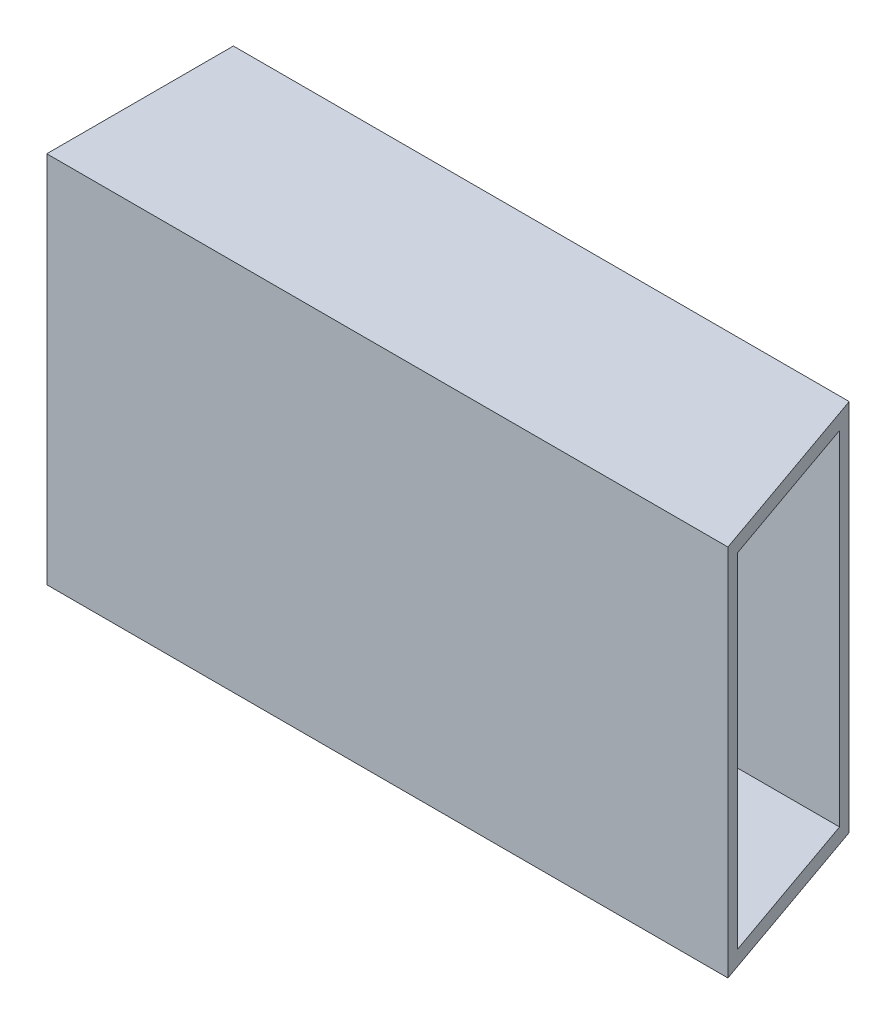
ISO-10303-21;
HEADER;
FILE_DESCRIPTION(('STEP AP214'),'2;1');
FILE_NAME('part.step','',(''),(''),'','','');
FILE_SCHEMA(('AUTOMOTIVE_DESIGN { 1 0 10303 214 1 1 1 1 }'));
ENDSEC;
DATA;
#1=APPLICATION_CONTEXT('core data for automotive mechanical design processes');
#2=APPLICATION_PROTOCOL_DEFINITION('international standard','automotive_design',2000,#1);
#3=PRODUCT_CONTEXT('',#1,'mechanical');
#4=PRODUCT('Part','Part','',(#3));
#5=PRODUCT_RELATED_PRODUCT_CATEGORY('part','',(#4));
#6=PRODUCT_DEFINITION_FORMATION('','',#4);
#7=PRODUCT_DEFINITION_CONTEXT('part definition',#1,'design');
#8=PRODUCT_DEFINITION('design','',#6,#7);
#9=PRODUCT_DEFINITION_SHAPE('','',#8);
#10=(LENGTH_UNIT() NAMED_UNIT(*) SI_UNIT(.MILLI.,.METRE.));
#11=(NAMED_UNIT(*) PLANE_ANGLE_UNIT() SI_UNIT($,.RADIAN.));
#12=(NAMED_UNIT(*) SI_UNIT($,.STERADIAN.) SOLID_ANGLE_UNIT());
#13=UNCERTAINTY_MEASURE_WITH_UNIT(LENGTH_MEASURE(1.E-05),#10,'distance_accuracy_value','');
#14=(GEOMETRIC_REPRESENTATION_CONTEXT(3) GLOBAL_UNCERTAINTY_ASSIGNED_CONTEXT((#13)) GLOBAL_UNIT_ASSIGNED_CONTEXT((#10,
#11,#12)) REPRESENTATION_CONTEXT('',''));
#15=CARTESIAN_POINT('',(0.,0.,0.));
#16=DIRECTION('',(0.,0.,1.));
#17=DIRECTION('',(1.,0.,0.));
#18=AXIS2_PLACEMENT_3D('',#15,#16,#17);
#19=CARTESIAN_POINT('',(0.,100.,-50.));
#20=DIRECTION('',(1.,0.,0.));
#21=DIRECTION('',(0.,0.,-1.));
#22=AXIS2_PLACEMENT_3D('',#19,#20,#21);
#23=PLANE('',#22);
#24=DIRECTION('',(0.,0.,1.));
#25=VECTOR('',#24,1.);
#26=CARTESIAN_POINT('',(0.,4.,-46.));
#27=LINE('',#26,#25);
#28=CARTESIAN_POINT('',(0.,4.,-46.));
#29=VERTEX_POINT('',#28);
#30=CARTESIAN_POINT('',(0.,4.,-4.));
#31=VERTEX_POINT('',#30);
#32=EDGE_CURVE('E116',#29,#31,#27,.T.);
#33=ORIENTED_EDGE('',*,*,#32,.F.);
#34=DIRECTION('',(0.,-1.,0.));
#35=VECTOR('',#34,1.);
#36=CARTESIAN_POINT('',(0.,96.,-46.));
#37=LINE('',#36,#35);
#38=CARTESIAN_POINT('',(0.,96.,-46.));
#39=VERTEX_POINT('',#38);
#40=EDGE_CURVE('E54',#39,#29,#37,.T.);
#41=ORIENTED_EDGE('',*,*,#40,.F.);
#42=DIRECTION('',(0.,0.,-1.));
#43=VECTOR('',#42,1.);
#44=CARTESIAN_POINT('',(0.,96.,-4.));
#45=LINE('',#44,#43);
#46=CARTESIAN_POINT('',(0.,96.,-4.));
#47=VERTEX_POINT('',#46);
#48=EDGE_CURVE('E122',#47,#39,#45,.T.);
#49=ORIENTED_EDGE('',*,*,#48,.F.);
#50=DIRECTION('',(0.,1.,0.));
#51=VECTOR('',#50,1.);
#52=CARTESIAN_POINT('',(0.,4.,-4.));
#53=LINE('',#52,#51);
#54=EDGE_CURVE('E107',#31,#47,#53,.T.);
#55=ORIENTED_EDGE('',*,*,#54,.F.);
#56=EDGE_LOOP('',(#33,#41,#49,#55));
#57=FACE_BOUND('',#56,.T.);
#58=DIRECTION('',(0.,0.,1.));
#59=VECTOR('',#58,1.);
#60=CARTESIAN_POINT('',(0.,0.,-50.));
#61=LINE('',#60,#59);
#62=CARTESIAN_POINT('',(0.,0.,-50.));
#63=VERTEX_POINT('',#62);
#64=CARTESIAN_POINT('',(0.,0.,0.));
#65=VERTEX_POINT('',#64);
#66=EDGE_CURVE('E129',#63,#65,#61,.T.);
#67=ORIENTED_EDGE('',*,*,#66,.T.);
#68=DIRECTION('',(0.,-1.,0.));
#69=VECTOR('',#68,1.);
#70=CARTESIAN_POINT('',(0.,100.,0.));
#71=LINE('',#70,#69);
#72=CARTESIAN_POINT('',(0.,100.,0.));
#73=VERTEX_POINT('',#72);
#74=EDGE_CURVE('E158',#73,#65,#71,.T.);
#75=ORIENTED_EDGE('',*,*,#74,.F.);
#76=DIRECTION('',(0.,0.,1.));
#77=VECTOR('',#76,1.);
#78=CARTESIAN_POINT('',(0.,100.,-50.));
#79=LINE('',#78,#77);
#80=CARTESIAN_POINT('',(0.,100.,-50.));
#81=VERTEX_POINT('',#80);
#82=EDGE_CURVE('E132',#81,#73,#79,.T.);
#83=ORIENTED_EDGE('',*,*,#82,.F.);
#84=DIRECTION('',(0.,-1.,0.));
#85=VECTOR('',#84,1.);
#86=CARTESIAN_POINT('',(0.,100.,-50.));
#87=LINE('',#86,#85);
#88=EDGE_CURVE('E142',#81,#63,#87,.T.);
#89=ORIENTED_EDGE('',*,*,#88,.T.);
#90=EDGE_LOOP('',(#67,#75,#83,#89));
#91=FACE_BOUND('',#90,.T.);
#92=ADVANCED_FACE('F40',(#57,#91),#23,.F.);
#93=CARTESIAN_POINT('',(0.,100.,0.));
#94=DIRECTION('',(0.,0.,-1.));
#95=DIRECTION('',(-1.,0.,0.));
#96=AXIS2_PLACEMENT_3D('',#93,#94,#95);
#97=PLANE('',#96);
#98=DIRECTION('',(1.,0.,0.));
#99=VECTOR('',#98,1.);
#100=CARTESIAN_POINT('',(0.,0.,0.));
#101=LINE('',#100,#99);
#102=CARTESIAN_POINT('',(182.5,0.,0.));
#103=VERTEX_POINT('',#102);
#104=EDGE_CURVE('E145',#65,#103,#101,.T.);
#105=ORIENTED_EDGE('',*,*,#104,.T.);
#106=DIRECTION('',(0.,-1.,0.));
#107=VECTOR('',#106,1.);
#108=CARTESIAN_POINT('',(182.5,100.,0.));
#109=LINE('',#108,#107);
#110=CARTESIAN_POINT('',(182.5,100.,0.));
#111=VERTEX_POINT('',#110);
#112=EDGE_CURVE('E155',#111,#103,#109,.T.);
#113=ORIENTED_EDGE('',*,*,#112,.F.);
#114=DIRECTION('',(1.,0.,0.));
#115=VECTOR('',#114,1.);
#116=CARTESIAN_POINT('',(0.,100.,0.));
#117=LINE('',#116,#115);
#118=EDGE_CURVE('E135',#73,#111,#117,.T.);
#119=ORIENTED_EDGE('',*,*,#118,.F.);
#120=ORIENTED_EDGE('',*,*,#74,.T.);
#121=EDGE_LOOP('',(#105,#113,#119,#120));
#122=FACE_BOUND('',#121,.T.);
#123=ADVANCED_FACE('F185',(#122),#97,.F.);
#124=CARTESIAN_POINT('',(182.5,100.,0.));
#125=DIRECTION('',(-0.943858356366017,0.,0.330350424728106));
#126=DIRECTION('',(0.330350424728106,0.,0.943858356366018));
#127=AXIS2_PLACEMENT_3D('',#124,#125,#126);
#128=PLANE('',#127);
#129=DIRECTION('',(-0.330350424728106,0.,-0.943858356366018));
#130=VECTOR('',#129,1.);
#131=CARTESIAN_POINT('',(182.5,96.,0.));
#132=LINE('',#131,#130);
#133=CARTESIAN_POINT('',(181.1,96.,-4.));
#134=VERTEX_POINT('',#133);
#135=CARTESIAN_POINT('',(166.4,96.,-46.));
#136=VERTEX_POINT('',#135);
#137=EDGE_CURVE('E47',#134,#136,#132,.T.);
#138=ORIENTED_EDGE('',*,*,#137,.T.);
#139=DIRECTION('',(0.,-1.,0.));
#140=VECTOR('',#139,1.);
#141=CARTESIAN_POINT('',(166.4,100.,-46.));
#142=LINE('',#141,#140);
#143=CARTESIAN_POINT('',(166.4,4.,-46.));
#144=VERTEX_POINT('',#143);
#145=EDGE_CURVE('E11',#136,#144,#142,.T.);
#146=ORIENTED_EDGE('',*,*,#145,.T.);
#147=DIRECTION('',(0.330350424728106,0.,0.943858356366018));
#148=VECTOR('',#147,1.);
#149=CARTESIAN_POINT('',(182.5,4.,0.));
#150=LINE('',#149,#148);
#151=CARTESIAN_POINT('',(181.1,4.,-4.));
#152=VERTEX_POINT('',#151);
#153=EDGE_CURVE('E161',#144,#152,#150,.T.);
#154=ORIENTED_EDGE('',*,*,#153,.T.);
#155=DIRECTION('',(0.,1.,0.));
#156=VECTOR('',#155,1.);
#157=CARTESIAN_POINT('',(181.1,100.,-4.));
#158=LINE('',#157,#156);
#159=EDGE_CURVE('E110',#152,#134,#158,.T.);
#160=ORIENTED_EDGE('',*,*,#159,.T.);
#161=EDGE_LOOP('',(#138,#146,#154,#160));
#162=FACE_BOUND('',#161,.T.);
#163=DIRECTION('',(-0.330350424728106,0.,-0.943858356366017));
#164=VECTOR('',#163,1.);
#165=CARTESIAN_POINT('',(182.5,0.,0.));
#166=LINE('',#165,#164);
#167=CARTESIAN_POINT('',(165.,0.,-50.));
#168=VERTEX_POINT('',#167);
#169=EDGE_CURVE('E147',#103,#168,#166,.T.);
#170=ORIENTED_EDGE('',*,*,#169,.T.);
#171=DIRECTION('',(0.,-1.,0.));
#172=VECTOR('',#171,1.);
#173=CARTESIAN_POINT('',(165.,100.,-50.));
#174=LINE('',#173,#172);
#175=CARTESIAN_POINT('',(165.,100.,-50.));
#176=VERTEX_POINT('',#175);
#177=EDGE_CURVE('E152',#176,#168,#174,.T.);
#178=ORIENTED_EDGE('',*,*,#177,.F.);
#179=DIRECTION('',(-0.330350424728106,0.,-0.943858356366017));
#180=VECTOR('',#179,1.);
#181=CARTESIAN_POINT('',(182.5,100.,0.));
#182=LINE('',#181,#180);
#183=EDGE_CURVE('E138',#111,#176,#182,.T.);
#184=ORIENTED_EDGE('',*,*,#183,.F.);
#185=ORIENTED_EDGE('',*,*,#112,.T.);
#186=EDGE_LOOP('',(#170,#178,#184,#185));
#187=FACE_BOUND('',#186,.T.);
#188=ADVANCED_FACE('F165',(#162,#187),#128,.F.);
#189=CARTESIAN_POINT('',(165.,100.,-50.));
#190=DIRECTION('',(0.,0.,1.));
#191=DIRECTION('',(1.,0.,0.));
#192=AXIS2_PLACEMENT_3D('',#189,#190,#191);
#193=PLANE('',#192);
#194=DIRECTION('',(-1.,0.,0.));
#195=VECTOR('',#194,1.);
#196=CARTESIAN_POINT('',(165.,0.,-50.));
#197=LINE('',#196,#195);
#198=EDGE_CURVE('E136',#168,#63,#197,.T.);
#199=ORIENTED_EDGE('',*,*,#198,.T.);
#200=ORIENTED_EDGE('',*,*,#88,.F.);
#201=DIRECTION('',(-1.,0.,0.));
#202=VECTOR('',#201,1.);
#203=CARTESIAN_POINT('',(165.,100.,-50.));
#204=LINE('',#203,#202);
#205=EDGE_CURVE('E140',#176,#81,#204,.T.);
#206=ORIENTED_EDGE('',*,*,#205,.F.);
#207=ORIENTED_EDGE('',*,*,#177,.T.);
#208=EDGE_LOOP('',(#199,#200,#206,#207));
#209=FACE_BOUND('',#208,.T.);
#210=ADVANCED_FACE('F193',(#209),#193,.F.);
#211=CARTESIAN_POINT('',(0.,100.,0.));
#212=DIRECTION('',(0.,1.,0.));
#213=DIRECTION('',(0.,0.,1.));
#214=AXIS2_PLACEMENT_3D('',#211,#212,#213);
#215=PLANE('',#214);
#216=ORIENTED_EDGE('',*,*,#82,.T.);
#217=ORIENTED_EDGE('',*,*,#118,.T.);
#218=ORIENTED_EDGE('',*,*,#183,.T.);
#219=ORIENTED_EDGE('',*,*,#205,.T.);
#220=EDGE_LOOP('',(#216,#217,#218,#219));
#221=FACE_BOUND('',#220,.T.);
#222=ADVANCED_FACE('F179',(#221),#215,.T.);
#223=CARTESIAN_POINT('',(0.,0.,0.));
#224=DIRECTION('',(0.,1.,0.));
#225=DIRECTION('',(0.,0.,1.));
#226=AXIS2_PLACEMENT_3D('',#223,#224,#225);
#227=PLANE('',#226);
#228=ORIENTED_EDGE('',*,*,#66,.F.);
#229=ORIENTED_EDGE('',*,*,#198,.F.);
#230=ORIENTED_EDGE('',*,*,#169,.F.);
#231=ORIENTED_EDGE('',*,*,#104,.F.);
#232=EDGE_LOOP('',(#228,#229,#230,#231));
#233=FACE_BOUND('',#232,.T.);
#234=ADVANCED_FACE('F172',(#233),#227,.F.);
#235=CARTESIAN_POINT('',(200.,96.,-46.));
#236=DIRECTION('',(0.,0.,-1.));
#237=DIRECTION('',(0.,1.,0.));
#238=AXIS2_PLACEMENT_3D('',#235,#236,#237);
#239=PLANE('',#238);
#240=DIRECTION('',(-1.,0.,0.));
#241=VECTOR('',#240,1.);
#242=CARTESIAN_POINT('',(200.,96.,-46.));
#243=LINE('',#242,#241);
#244=EDGE_CURVE('E127',#136,#39,#243,.T.);
#245=ORIENTED_EDGE('',*,*,#244,.T.);
#246=ORIENTED_EDGE('',*,*,#40,.T.);
#247=DIRECTION('',(-1.,0.,0.));
#248=VECTOR('',#247,1.);
#249=CARTESIAN_POINT('',(200.,4.,-46.));
#250=LINE('',#249,#248);
#251=EDGE_CURVE('E113',#144,#29,#250,.T.);
#252=ORIENTED_EDGE('',*,*,#251,.F.);
#253=ORIENTED_EDGE('',*,*,#145,.F.);
#254=EDGE_LOOP('',(#245,#246,#252,#253));
#255=FACE_BOUND('',#254,.T.);
#256=ADVANCED_FACE('F170',(#255),#239,.F.);
#257=CARTESIAN_POINT('',(200.,96.,-4.));
#258=DIRECTION('',(0.,1.,0.));
#259=DIRECTION('',(0.,0.,1.));
#260=AXIS2_PLACEMENT_3D('',#257,#258,#259);
#261=PLANE('',#260);
#262=DIRECTION('',(-1.,0.,0.));
#263=VECTOR('',#262,1.);
#264=CARTESIAN_POINT('',(200.,96.,-4.));
#265=LINE('',#264,#263);
#266=EDGE_CURVE('E112',#134,#47,#265,.T.);
#267=ORIENTED_EDGE('',*,*,#266,.T.);
#268=ORIENTED_EDGE('',*,*,#48,.T.);
#269=ORIENTED_EDGE('',*,*,#244,.F.);
#270=ORIENTED_EDGE('',*,*,#137,.F.);
#271=EDGE_LOOP('',(#267,#268,#269,#270));
#272=FACE_BOUND('',#271,.T.);
#273=ADVANCED_FACE('F169',(#272),#261,.F.);
#274=CARTESIAN_POINT('',(200.,4.,-4.));
#275=DIRECTION('',(0.,0.,1.));
#276=DIRECTION('',(0.,-1.,0.));
#277=AXIS2_PLACEMENT_3D('',#274,#275,#276);
#278=PLANE('',#277);
#279=DIRECTION('',(-1.,0.,0.));
#280=VECTOR('',#279,1.);
#281=CARTESIAN_POINT('',(200.,4.,-4.));
#282=LINE('',#281,#280);
#283=EDGE_CURVE('E62',#152,#31,#282,.T.);
#284=ORIENTED_EDGE('',*,*,#283,.T.);
#285=ORIENTED_EDGE('',*,*,#54,.T.);
#286=ORIENTED_EDGE('',*,*,#266,.F.);
#287=ORIENTED_EDGE('',*,*,#159,.F.);
#288=EDGE_LOOP('',(#284,#285,#286,#287));
#289=FACE_BOUND('',#288,.T.);
#290=ADVANCED_FACE('F104',(#289),#278,.F.);
#291=CARTESIAN_POINT('',(200.,4.,-46.));
#292=DIRECTION('',(0.,-1.,0.));
#293=DIRECTION('',(0.,0.,-1.));
#294=AXIS2_PLACEMENT_3D('',#291,#292,#293);
#295=PLANE('',#294);
#296=ORIENTED_EDGE('',*,*,#251,.T.);
#297=ORIENTED_EDGE('',*,*,#32,.T.);
#298=ORIENTED_EDGE('',*,*,#283,.F.);
#299=ORIENTED_EDGE('',*,*,#153,.F.);
#300=EDGE_LOOP('',(#296,#297,#298,#299));
#301=FACE_BOUND('',#300,.T.);
#302=ADVANCED_FACE('F117',(#301),#295,.F.);
#303=CLOSED_SHELL('',(#92,#123,#188,#210,#222,#234,#256,#273,#290,#302));
#304=MANIFOLD_SOLID_BREP('B2',#303);
#305=ADVANCED_BREP_SHAPE_REPRESENTATION('',(#18,#304),#14);
#306=SHAPE_DEFINITION_REPRESENTATION(#9,#305);
ENDSEC;
END-ISO-10303-21;
